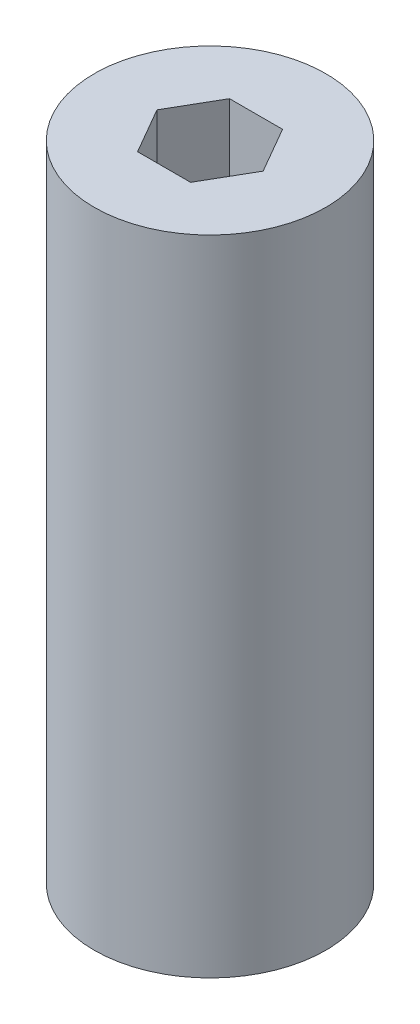
ISO-10303-21;
HEADER;
FILE_DESCRIPTION(('STEP AP214'),'2;1');
FILE_NAME('part.step','',(''),(''),'','','');
FILE_SCHEMA(('AUTOMOTIVE_DESIGN { 1 0 10303 214 1 1 1 1 }'));
ENDSEC;
DATA;
#1=APPLICATION_CONTEXT('core data for automotive mechanical design processes');
#2=APPLICATION_PROTOCOL_DEFINITION('international standard','automotive_design',2000,#1);
#3=PRODUCT_CONTEXT('',#1,'mechanical');
#4=PRODUCT('Part','Part','',(#3));
#5=PRODUCT_RELATED_PRODUCT_CATEGORY('part','',(#4));
#6=PRODUCT_DEFINITION_FORMATION('','',#4);
#7=PRODUCT_DEFINITION_CONTEXT('part definition',#1,'design');
#8=PRODUCT_DEFINITION('design','',#6,#7);
#9=PRODUCT_DEFINITION_SHAPE('','',#8);
#10=(LENGTH_UNIT() NAMED_UNIT(*) SI_UNIT(.MILLI.,.METRE.));
#11=(NAMED_UNIT(*) PLANE_ANGLE_UNIT() SI_UNIT($,.RADIAN.));
#12=(NAMED_UNIT(*) SI_UNIT($,.STERADIAN.) SOLID_ANGLE_UNIT());
#13=UNCERTAINTY_MEASURE_WITH_UNIT(LENGTH_MEASURE(1.E-05),#10,'distance_accuracy_value','');
#14=(GEOMETRIC_REPRESENTATION_CONTEXT(3) GLOBAL_UNCERTAINTY_ASSIGNED_CONTEXT((#13)) GLOBAL_UNIT_ASSIGNED_CONTEXT((#10,
#11,#12)) REPRESENTATION_CONTEXT('',''));
#15=CARTESIAN_POINT('',(0.,0.,0.));
#16=DIRECTION('',(0.,0.,1.));
#17=DIRECTION('',(1.,0.,0.));
#18=AXIS2_PLACEMENT_3D('',#15,#16,#17);
#19=CARTESIAN_POINT('',(0.,88.9,0.));
#20=DIRECTION('',(0.,-1.,0.));
#21=DIRECTION('',(0.,0.,-1.));
#22=AXIS2_PLACEMENT_3D('',#19,#20,#21);
#23=CYLINDRICAL_SURFACE('',#22,16.002);
#24=CARTESIAN_POINT('',(0.,88.9,0.));
#25=DIRECTION('',(0.,1.,0.));
#26=DIRECTION('',(0.,0.,1.));
#27=AXIS2_PLACEMENT_3D('',#24,#25,#26);
#28=CIRCLE('',#27,16.002);
#29=CARTESIAN_POINT('',(0.,88.9,16.002));
#30=VERTEX_POINT('',#29);
#31=EDGE_CURVE('E11',#30,#30,#28,.T.);
#32=ORIENTED_EDGE('',*,*,#31,.F.);
#33=EDGE_LOOP('',(#32));
#34=FACE_BOUND('',#33,.T.);
#35=CARTESIAN_POINT('',(0.,0.,0.));
#36=DIRECTION('',(0.,1.,0.));
#37=DIRECTION('',(0.,0.,1.));
#38=AXIS2_PLACEMENT_3D('',#35,#36,#37);
#39=CIRCLE('',#38,16.002);
#40=CARTESIAN_POINT('',(0.,0.,16.002));
#41=VERTEX_POINT('',#40);
#42=EDGE_CURVE('E36',#41,#41,#39,.T.);
#43=ORIENTED_EDGE('',*,*,#42,.T.);
#44=EDGE_LOOP('',(#43));
#45=FACE_BOUND('',#44,.T.);
#46=ADVANCED_FACE('F33',(#34,#45),#23,.T.);
#47=CARTESIAN_POINT('',(0.,88.9,0.));
#48=DIRECTION('',(0.,1.,0.));
#49=DIRECTION('',(0.,0.,1.));
#50=AXIS2_PLACEMENT_3D('',#47,#48,#49);
#51=PLANE('',#50);
#52=DIRECTION('',(0.5,0.,-0.866025403784439));
#53=VECTOR('',#52,1.);
#54=CARTESIAN_POINT('',(3.66617420935413,88.9,6.35000000000001));
#55=LINE('',#54,#53);
#56=CARTESIAN_POINT('',(3.66617420935413,88.9,6.35000000000001));
#57=VERTEX_POINT('',#56);
#58=CARTESIAN_POINT('',(7.33234841870825,88.9,0.));
#59=VERTEX_POINT('',#58);
#60=EDGE_CURVE('E47',#57,#59,#55,.T.);
#61=ORIENTED_EDGE('',*,*,#60,.F.);
#62=DIRECTION('',(1.,0.,0.));
#63=VECTOR('',#62,1.);
#64=CARTESIAN_POINT('',(-3.66617420935412,88.9,6.35000000000001));
#65=LINE('',#64,#63);
#66=CARTESIAN_POINT('',(-3.66617420935412,88.9,6.35000000000001));
#67=VERTEX_POINT('',#66);
#68=EDGE_CURVE('E104',#67,#57,#65,.T.);
#69=ORIENTED_EDGE('',*,*,#68,.F.);
#70=DIRECTION('',(0.5,0.,0.866025403784439));
#71=VECTOR('',#70,1.);
#72=CARTESIAN_POINT('',(-7.33234841870825,88.9,0.));
#73=LINE('',#72,#71);
#74=CARTESIAN_POINT('',(-7.33234841870825,88.9,0.));
#75=VERTEX_POINT('',#74);
#76=EDGE_CURVE('E107',#75,#67,#73,.T.);
#77=ORIENTED_EDGE('',*,*,#76,.F.);
#78=DIRECTION('',(-0.5,0.,0.866025403784439));
#79=VECTOR('',#78,1.);
#80=CARTESIAN_POINT('',(-3.66617420935413,88.9,-6.35));
#81=LINE('',#80,#79);
#82=CARTESIAN_POINT('',(-3.66617420935413,88.9,-6.35));
#83=VERTEX_POINT('',#82);
#84=EDGE_CURVE('E123',#83,#75,#81,.T.);
#85=ORIENTED_EDGE('',*,*,#84,.F.);
#86=DIRECTION('',(-1.,0.,0.));
#87=VECTOR('',#86,1.);
#88=CARTESIAN_POINT('',(3.66617420935412,88.9,-6.35000000000001));
#89=LINE('',#88,#87);
#90=CARTESIAN_POINT('',(3.66617420935412,88.9,-6.35000000000001));
#91=VERTEX_POINT('',#90);
#92=EDGE_CURVE('E120',#91,#83,#89,.T.);
#93=ORIENTED_EDGE('',*,*,#92,.F.);
#94=DIRECTION('',(-0.5,0.,-0.866025403784439));
#95=VECTOR('',#94,1.);
#96=CARTESIAN_POINT('',(7.33234841870825,88.9,0.));
#97=LINE('',#96,#95);
#98=EDGE_CURVE('E118',#59,#91,#97,.T.);
#99=ORIENTED_EDGE('',*,*,#98,.F.);
#100=EDGE_LOOP('',(#61,#69,#77,#85,#93,#99));
#101=FACE_BOUND('',#100,.T.);
#102=ORIENTED_EDGE('',*,*,#31,.T.);
#103=EDGE_LOOP('',(#102));
#104=FACE_BOUND('',#103,.T.);
#105=ADVANCED_FACE('F140',(#101,#104),#51,.T.);
#106=CARTESIAN_POINT('',(0.,0.,0.));
#107=DIRECTION('',(0.,1.,0.));
#108=DIRECTION('',(0.,0.,1.));
#109=AXIS2_PLACEMENT_3D('',#106,#107,#108);
#110=PLANE('',#109);
#111=DIRECTION('',(1.,0.,0.));
#112=VECTOR('',#111,1.);
#113=CARTESIAN_POINT('',(-3.66617420935412,0.,6.35000000000001));
#114=LINE('',#113,#112);
#115=CARTESIAN_POINT('',(-3.66617420935412,0.,6.35000000000001));
#116=VERTEX_POINT('',#115);
#117=CARTESIAN_POINT('',(3.66617420935413,0.,6.35000000000001));
#118=VERTEX_POINT('',#117);
#119=EDGE_CURVE('E93',#116,#118,#114,.T.);
#120=ORIENTED_EDGE('',*,*,#119,.T.);
#121=DIRECTION('',(0.5,0.,-0.866025403784439));
#122=VECTOR('',#121,1.);
#123=CARTESIAN_POINT('',(3.66617420935413,0.,6.35000000000001));
#124=LINE('',#123,#122);
#125=CARTESIAN_POINT('',(7.33234841870825,0.,0.));
#126=VERTEX_POINT('',#125);
#127=EDGE_CURVE('E87',#118,#126,#124,.T.);
#128=ORIENTED_EDGE('',*,*,#127,.T.);
#129=DIRECTION('',(-0.5,0.,-0.866025403784439));
#130=VECTOR('',#129,1.);
#131=CARTESIAN_POINT('',(7.33234841870825,0.,0.));
#132=LINE('',#131,#130);
#133=CARTESIAN_POINT('',(3.66617420935412,0.,-6.35));
#134=VERTEX_POINT('',#133);
#135=EDGE_CURVE('E96',#126,#134,#132,.T.);
#136=ORIENTED_EDGE('',*,*,#135,.T.);
#137=DIRECTION('',(-1.,0.,0.));
#138=VECTOR('',#137,1.);
#139=CARTESIAN_POINT('',(3.66617420935412,0.,-6.35000000000001));
#140=LINE('',#139,#138);
#141=CARTESIAN_POINT('',(-3.66617420935413,0.,-6.35));
#142=VERTEX_POINT('',#141);
#143=EDGE_CURVE('E55',#134,#142,#140,.T.);
#144=ORIENTED_EDGE('',*,*,#143,.T.);
#145=DIRECTION('',(-0.5,0.,0.866025403784439));
#146=VECTOR('',#145,1.);
#147=CARTESIAN_POINT('',(-3.66617420935413,0.,-6.35));
#148=LINE('',#147,#146);
#149=CARTESIAN_POINT('',(-7.33234841870825,0.,0.));
#150=VERTEX_POINT('',#149);
#151=EDGE_CURVE('E111',#142,#150,#148,.T.);
#152=ORIENTED_EDGE('',*,*,#151,.T.);
#153=DIRECTION('',(0.5,0.,0.866025403784439));
#154=VECTOR('',#153,1.);
#155=CARTESIAN_POINT('',(-7.33234841870825,0.,0.));
#156=LINE('',#155,#154);
#157=EDGE_CURVE('E114',#150,#116,#156,.T.);
#158=ORIENTED_EDGE('',*,*,#157,.T.);
#159=EDGE_LOOP('',(#120,#128,#136,#144,#152,#158));
#160=FACE_BOUND('',#159,.T.);
#161=ORIENTED_EDGE('',*,*,#42,.F.);
#162=EDGE_LOOP('',(#161));
#163=FACE_BOUND('',#162,.T.);
#164=ADVANCED_FACE('F100',(#160,#163),#110,.F.);
#165=CARTESIAN_POINT('',(3.66617420935413,0.,6.35000000000001));
#166=DIRECTION('',(0.866025403784439,0.,0.5));
#167=DIRECTION('',(0.5,0.,-0.866025403784439));
#168=AXIS2_PLACEMENT_3D('',#165,#166,#167);
#169=PLANE('',#168);
#170=ORIENTED_EDGE('',*,*,#60,.T.);
#171=DIRECTION('',(0.,1.,0.));
#172=VECTOR('',#171,1.);
#173=CARTESIAN_POINT('',(7.33234841870825,0.,0.));
#174=LINE('',#173,#172);
#175=EDGE_CURVE('E83',#126,#59,#174,.T.);
#176=ORIENTED_EDGE('',*,*,#175,.F.);
#177=ORIENTED_EDGE('',*,*,#127,.F.);
#178=DIRECTION('',(0.,1.,0.));
#179=VECTOR('',#178,1.);
#180=CARTESIAN_POINT('',(3.66617420935413,0.,6.35000000000001));
#181=LINE('',#180,#179);
#182=EDGE_CURVE('E128',#118,#57,#181,.T.);
#183=ORIENTED_EDGE('',*,*,#182,.T.);
#184=EDGE_LOOP('',(#170,#176,#177,#183));
#185=FACE_BOUND('',#184,.T.);
#186=ADVANCED_FACE('F85',(#185),#169,.F.);
#187=CARTESIAN_POINT('',(-3.66617420935412,0.,6.35000000000001));
#188=DIRECTION('',(0.,0.,1.));
#189=DIRECTION('',(1.,0.,0.));
#190=AXIS2_PLACEMENT_3D('',#187,#188,#189);
#191=PLANE('',#190);
#192=ORIENTED_EDGE('',*,*,#68,.T.);
#193=ORIENTED_EDGE('',*,*,#182,.F.);
#194=ORIENTED_EDGE('',*,*,#119,.F.);
#195=DIRECTION('',(0.,1.,0.));
#196=VECTOR('',#195,1.);
#197=CARTESIAN_POINT('',(-3.66617420935412,0.,6.35000000000001));
#198=LINE('',#197,#196);
#199=EDGE_CURVE('E130',#116,#67,#198,.T.);
#200=ORIENTED_EDGE('',*,*,#199,.T.);
#201=EDGE_LOOP('',(#192,#193,#194,#200));
#202=FACE_BOUND('',#201,.T.);
#203=ADVANCED_FACE('F151',(#202),#191,.F.);
#204=CARTESIAN_POINT('',(-7.33234841870825,0.,0.));
#205=DIRECTION('',(-0.866025403784439,0.,0.5));
#206=DIRECTION('',(0.5,0.,0.866025403784439));
#207=AXIS2_PLACEMENT_3D('',#204,#205,#206);
#208=PLANE('',#207);
#209=ORIENTED_EDGE('',*,*,#76,.T.);
#210=ORIENTED_EDGE('',*,*,#199,.F.);
#211=ORIENTED_EDGE('',*,*,#157,.F.);
#212=DIRECTION('',(0.,1.,0.));
#213=VECTOR('',#212,1.);
#214=CARTESIAN_POINT('',(-7.33234841870825,0.,0.));
#215=LINE('',#214,#213);
#216=EDGE_CURVE('E132',#150,#75,#215,.T.);
#217=ORIENTED_EDGE('',*,*,#216,.T.);
#218=EDGE_LOOP('',(#209,#210,#211,#217));
#219=FACE_BOUND('',#218,.T.);
#220=ADVANCED_FACE('F149',(#219),#208,.F.);
#221=CARTESIAN_POINT('',(-3.66617420935413,0.,-6.35));
#222=DIRECTION('',(-0.866025403784439,0.,-0.5));
#223=DIRECTION('',(-0.5,0.,0.866025403784439));
#224=AXIS2_PLACEMENT_3D('',#221,#222,#223);
#225=PLANE('',#224);
#226=ORIENTED_EDGE('',*,*,#84,.T.);
#227=ORIENTED_EDGE('',*,*,#216,.F.);
#228=ORIENTED_EDGE('',*,*,#151,.F.);
#229=DIRECTION('',(0.,1.,0.));
#230=VECTOR('',#229,1.);
#231=CARTESIAN_POINT('',(-3.66617420935413,0.,-6.35));
#232=LINE('',#231,#230);
#233=EDGE_CURVE('E134',#142,#83,#232,.T.);
#234=ORIENTED_EDGE('',*,*,#233,.T.);
#235=EDGE_LOOP('',(#226,#227,#228,#234));
#236=FACE_BOUND('',#235,.T.);
#237=ADVANCED_FACE('F145',(#236),#225,.F.);
#238=CARTESIAN_POINT('',(3.66617420935412,0.,-6.35000000000001));
#239=DIRECTION('',(0.,0.,-1.));
#240=DIRECTION('',(-1.,0.,0.));
#241=AXIS2_PLACEMENT_3D('',#238,#239,#240);
#242=PLANE('',#241);
#243=ORIENTED_EDGE('',*,*,#92,.T.);
#244=ORIENTED_EDGE('',*,*,#233,.F.);
#245=ORIENTED_EDGE('',*,*,#143,.F.);
#246=DIRECTION('',(0.,1.,0.));
#247=VECTOR('',#246,1.);
#248=CARTESIAN_POINT('',(3.66617420935412,0.,-6.35000000000001));
#249=LINE('',#248,#247);
#250=EDGE_CURVE('E92',#134,#91,#249,.T.);
#251=ORIENTED_EDGE('',*,*,#250,.T.);
#252=EDGE_LOOP('',(#243,#244,#245,#251));
#253=FACE_BOUND('',#252,.T.);
#254=ADVANCED_FACE('F136',(#253),#242,.F.);
#255=CARTESIAN_POINT('',(7.33234841870825,0.,0.));
#256=DIRECTION('',(0.866025403784439,0.,-0.5));
#257=DIRECTION('',(-0.5,0.,-0.866025403784439));
#258=AXIS2_PLACEMENT_3D('',#255,#256,#257);
#259=PLANE('',#258);
#260=ORIENTED_EDGE('',*,*,#98,.T.);
#261=ORIENTED_EDGE('',*,*,#250,.F.);
#262=ORIENTED_EDGE('',*,*,#135,.F.);
#263=ORIENTED_EDGE('',*,*,#175,.T.);
#264=EDGE_LOOP('',(#260,#261,#262,#263));
#265=FACE_BOUND('',#264,.T.);
#266=ADVANCED_FACE('F97',(#265),#259,.F.);
#267=CLOSED_SHELL('',(#46,#105,#164,#186,#203,#220,#237,#254,#266));
#268=MANIFOLD_SOLID_BREP('B2',#267);
#269=ADVANCED_BREP_SHAPE_REPRESENTATION('',(#18,#268),#14);
#270=SHAPE_DEFINITION_REPRESENTATION(#9,#269);
ENDSEC;
END-ISO-10303-21;
